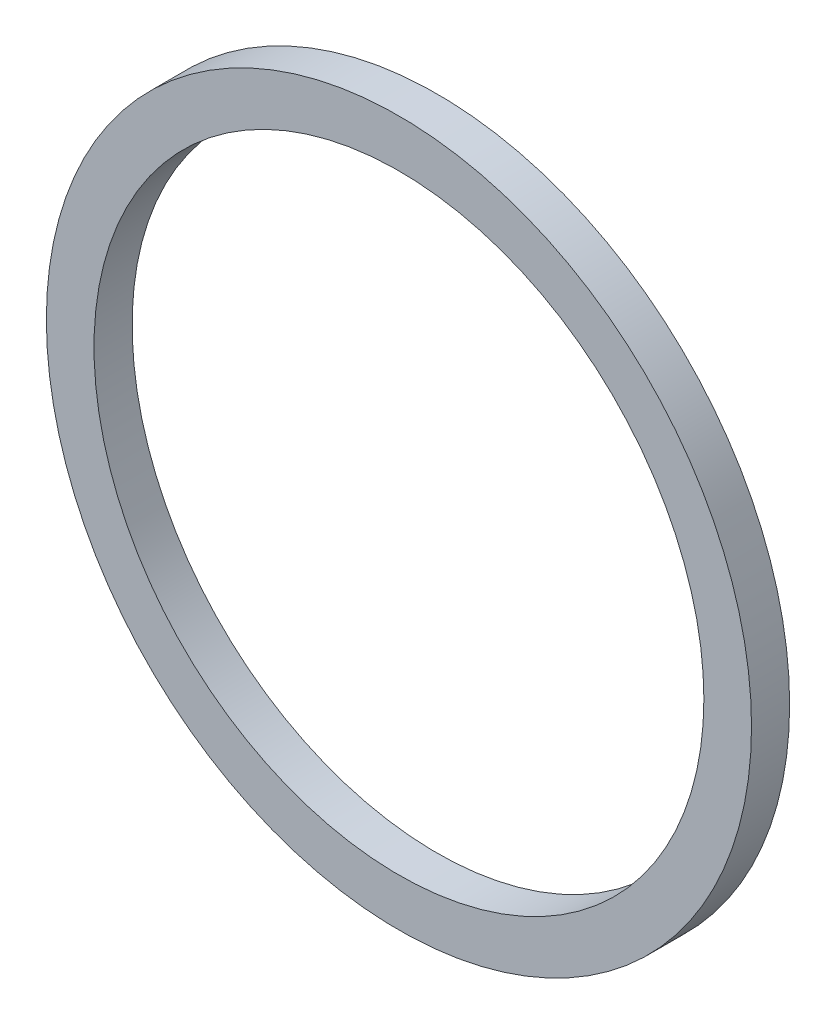
ISO-10303-21;
HEADER;
FILE_DESCRIPTION(('STEP AP214'),'2;1');
FILE_NAME('part.step','',(''),(''),'','','');
FILE_SCHEMA(('AUTOMOTIVE_DESIGN { 1 0 10303 214 1 1 1 1 }'));
ENDSEC;
DATA;
#1=APPLICATION_CONTEXT('core data for automotive mechanical design processes');
#2=APPLICATION_PROTOCOL_DEFINITION('international standard','automotive_design',2000,#1);
#3=PRODUCT_CONTEXT('',#1,'mechanical');
#4=PRODUCT('Part','Part','',(#3));
#5=PRODUCT_RELATED_PRODUCT_CATEGORY('part','',(#4));
#6=PRODUCT_DEFINITION_FORMATION('','',#4);
#7=PRODUCT_DEFINITION_CONTEXT('part definition',#1,'design');
#8=PRODUCT_DEFINITION('design','',#6,#7);
#9=PRODUCT_DEFINITION_SHAPE('','',#8);
#10=(LENGTH_UNIT() NAMED_UNIT(*) SI_UNIT(.MILLI.,.METRE.));
#11=(NAMED_UNIT(*) PLANE_ANGLE_UNIT() SI_UNIT($,.RADIAN.));
#12=(NAMED_UNIT(*) SI_UNIT($,.STERADIAN.) SOLID_ANGLE_UNIT());
#13=UNCERTAINTY_MEASURE_WITH_UNIT(LENGTH_MEASURE(1.E-05),#10,'distance_accuracy_value','');
#14=(GEOMETRIC_REPRESENTATION_CONTEXT(3) GLOBAL_UNCERTAINTY_ASSIGNED_CONTEXT((#13)) GLOBAL_UNIT_ASSIGNED_CONTEXT((#10,
#11,#12)) REPRESENTATION_CONTEXT('',''));
#15=CARTESIAN_POINT('',(0.,0.,0.));
#16=DIRECTION('',(0.,0.,1.));
#17=DIRECTION('',(1.,0.,0.));
#18=AXIS2_PLACEMENT_3D('',#15,#16,#17);
#19=CARTESIAN_POINT('',(0.,0.,0.4));
#20=DIRECTION('',(0.,0.,1.));
#21=DIRECTION('',(1.,0.,0.));
#22=AXIS2_PLACEMENT_3D('',#19,#20,#21);
#23=PLANE('',#22);
#24=CARTESIAN_POINT('',(0.,0.,0.4));
#25=DIRECTION('',(0.,0.,1.));
#26=DIRECTION('',(1.,0.,0.));
#27=AXIS2_PLACEMENT_3D('',#24,#25,#26);
#28=CIRCLE('',#27,3.7);
#29=CARTESIAN_POINT('',(3.7,0.,0.4));
#30=VERTEX_POINT('',#29);
#31=EDGE_CURVE('E10',#30,#30,#28,.T.);
#32=ORIENTED_EDGE('',*,*,#31,.T.);
#33=EDGE_LOOP('',(#32));
#34=FACE_BOUND('',#33,.T.);
#35=CARTESIAN_POINT('',(0.,0.,0.4));
#36=DIRECTION('',(0.,0.,1.));
#37=DIRECTION('',(1.,0.,0.));
#38=AXIS2_PLACEMENT_3D('',#35,#36,#37);
#39=CIRCLE('',#38,3.2);
#40=CARTESIAN_POINT('',(3.2,0.,0.4));
#41=VERTEX_POINT('',#40);
#42=EDGE_CURVE('E56',#41,#41,#39,.T.);
#43=ORIENTED_EDGE('',*,*,#42,.F.);
#44=EDGE_LOOP('',(#43));
#45=FACE_BOUND('',#44,.T.);
#46=ADVANCED_FACE('F43',(#34,#45),#23,.T.);
#47=CARTESIAN_POINT('',(0.,0.,0.));
#48=DIRECTION('',(0.,0.,1.));
#49=DIRECTION('',(1.,0.,0.));
#50=AXIS2_PLACEMENT_3D('',#47,#48,#49);
#51=PLANE('',#50);
#52=CARTESIAN_POINT('',(0.,0.,0.));
#53=DIRECTION('',(0.,0.,1.));
#54=DIRECTION('',(1.,0.,0.));
#55=AXIS2_PLACEMENT_3D('',#52,#53,#54);
#56=CIRCLE('',#55,3.7);
#57=CARTESIAN_POINT('',(3.7,0.,0.));
#58=VERTEX_POINT('',#57);
#59=EDGE_CURVE('E47',#58,#58,#56,.T.);
#60=ORIENTED_EDGE('',*,*,#59,.F.);
#61=EDGE_LOOP('',(#60));
#62=FACE_BOUND('',#61,.T.);
#63=CARTESIAN_POINT('',(0.,0.,0.));
#64=DIRECTION('',(0.,0.,1.));
#65=DIRECTION('',(1.,0.,0.));
#66=AXIS2_PLACEMENT_3D('',#63,#64,#65);
#67=CIRCLE('',#66,3.2);
#68=CARTESIAN_POINT('',(3.2,0.,0.));
#69=VERTEX_POINT('',#68);
#70=EDGE_CURVE('E58',#69,#69,#67,.T.);
#71=ORIENTED_EDGE('',*,*,#70,.T.);
#72=EDGE_LOOP('',(#71));
#73=FACE_BOUND('',#72,.T.);
#74=ADVANCED_FACE('F70',(#62,#73),#51,.F.);
#75=CARTESIAN_POINT('',(0.,0.,0.4));
#76=DIRECTION('',(0.,0.,-1.));
#77=DIRECTION('',(-1.,0.,0.));
#78=AXIS2_PLACEMENT_3D('',#75,#76,#77);
#79=CYLINDRICAL_SURFACE('',#78,3.7);
#80=ORIENTED_EDGE('',*,*,#31,.F.);
#81=EDGE_LOOP('',(#80));
#82=FACE_BOUND('',#81,.T.);
#83=ORIENTED_EDGE('',*,*,#59,.T.);
#84=EDGE_LOOP('',(#83));
#85=FACE_BOUND('',#84,.T.);
#86=ADVANCED_FACE('F45',(#82,#85),#79,.T.);
#87=CARTESIAN_POINT('',(0.,0.,0.4));
#88=DIRECTION('',(0.,0.,-1.));
#89=DIRECTION('',(-1.,0.,0.));
#90=AXIS2_PLACEMENT_3D('',#87,#88,#89);
#91=CYLINDRICAL_SURFACE('',#90,3.2);
#92=ORIENTED_EDGE('',*,*,#42,.T.);
#93=EDGE_LOOP('',(#92));
#94=FACE_BOUND('',#93,.T.);
#95=ORIENTED_EDGE('',*,*,#70,.F.);
#96=EDGE_LOOP('',(#95));
#97=FACE_BOUND('',#96,.T.);
#98=ADVANCED_FACE('F66',(#94,#97),#91,.F.);
#99=CLOSED_SHELL('',(#46,#74,#86,#98));
#100=MANIFOLD_SOLID_BREP('B2',#99);
#101=ADVANCED_BREP_SHAPE_REPRESENTATION('',(#18,#100),#14);
#102=SHAPE_DEFINITION_REPRESENTATION(#9,#101);
ENDSEC;
END-ISO-10303-21;
